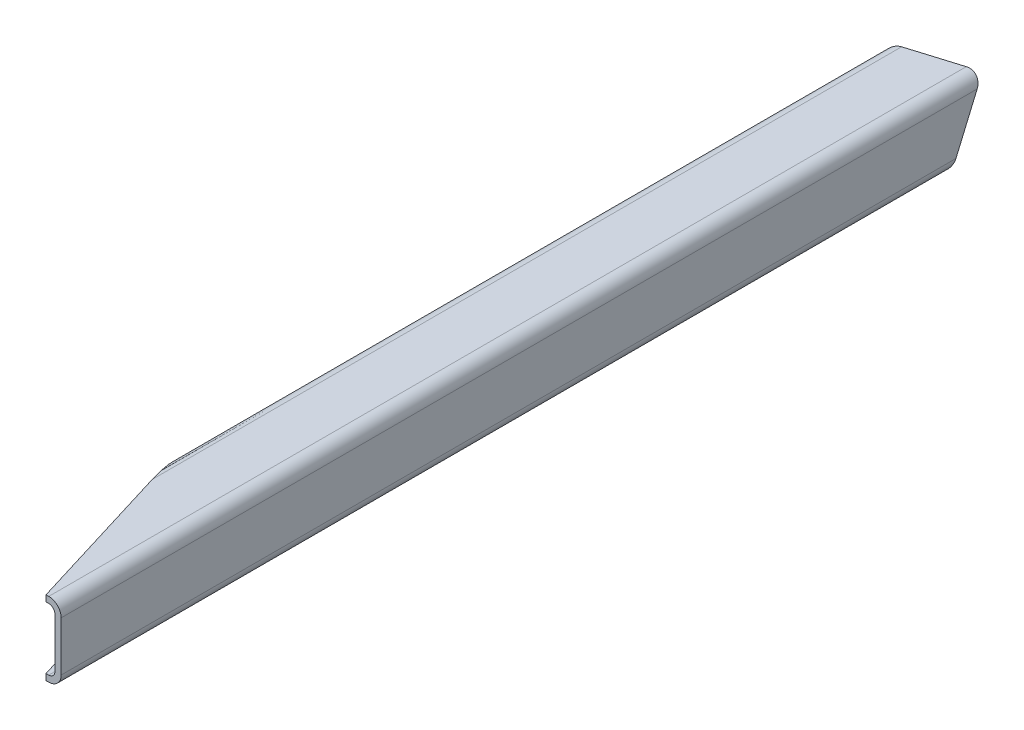
ISO-10303-21;
HEADER;
FILE_DESCRIPTION(('STEP AP214'),'2;1');
FILE_NAME('part.step','',(''),(''),'','','');
FILE_SCHEMA(('AUTOMOTIVE_DESIGN { 1 0 10303 214 1 1 1 1 }'));
ENDSEC;
DATA;
#1=APPLICATION_CONTEXT('core data for automotive mechanical design processes');
#2=APPLICATION_PROTOCOL_DEFINITION('international standard','automotive_design',2000,#1);
#3=PRODUCT_CONTEXT('',#1,'mechanical');
#4=PRODUCT('Part','Part','',(#3));
#5=PRODUCT_RELATED_PRODUCT_CATEGORY('part','',(#4));
#6=PRODUCT_DEFINITION_FORMATION('','',#4);
#7=PRODUCT_DEFINITION_CONTEXT('part definition',#1,'design');
#8=PRODUCT_DEFINITION('design','',#6,#7);
#9=PRODUCT_DEFINITION_SHAPE('','',#8);
#10=(LENGTH_UNIT() NAMED_UNIT(*) SI_UNIT(.MILLI.,.METRE.));
#11=(NAMED_UNIT(*) PLANE_ANGLE_UNIT() SI_UNIT($,.RADIAN.));
#12=(NAMED_UNIT(*) SI_UNIT($,.STERADIAN.) SOLID_ANGLE_UNIT());
#13=UNCERTAINTY_MEASURE_WITH_UNIT(LENGTH_MEASURE(1.E-05),#10,'distance_accuracy_value','');
#14=(GEOMETRIC_REPRESENTATION_CONTEXT(3) GLOBAL_UNCERTAINTY_ASSIGNED_CONTEXT((#13)) GLOBAL_UNIT_ASSIGNED_CONTEXT((#10,
#11,#12)) REPRESENTATION_CONTEXT('',''));
#15=CARTESIAN_POINT('',(0.,0.,0.));
#16=DIRECTION('',(0.,0.,1.));
#17=DIRECTION('',(1.,0.,0.));
#18=AXIS2_PLACEMENT_3D('',#15,#16,#17);
#19=CARTESIAN_POINT('',(25.4,-25.4,584.2));
#20=DIRECTION('',(0.,0.,-1.));
#21=DIRECTION('',(-1.,0.,0.));
#22=AXIS2_PLACEMENT_3D('',#19,#20,#21);
#23=CYLINDRICAL_SURFACE('',#22,12.7);
#24=DIRECTION('',(0.,0.,-1.));
#25=VECTOR('',#24,1.);
#26=CARTESIAN_POINT('',(25.3999999999999,-38.1,584.2));
#27=LINE('',#26,#25);
#28=CARTESIAN_POINT('',(25.3999999999999,-38.1,533.400000000001));
#29=VERTEX_POINT('',#28);
#30=CARTESIAN_POINT('',(25.3999999999999,-38.1,-374.694892337501));
#31=VERTEX_POINT('',#30);
#32=EDGE_CURVE('E183',#29,#31,#27,.T.);
#33=ORIENTED_EDGE('',*,*,#32,.T.);
#34=CARTESIAN_POINT('',(25.4,-25.4,-380.130488184915));
#35=DIRECTION('',(0.27058408825258,0.378797118906256,0.885040673581073));
#36=DIRECTION('',(0.514437970469112,0.72017398483454,-0.465513701309812));
#37=AXIS2_PLACEMENT_3D('',#34,#35,#36);
#38=ELLIPSE('',#37,14.3496229937241,12.7);
#39=CARTESIAN_POINT('',(38.1,-25.3999999999999,-384.01326783944));
#40=VERTEX_POINT('',#39);
#41=EDGE_CURVE('E169',#31,#40,#38,.T.);
#42=ORIENTED_EDGE('',*,*,#41,.T.);
#43=DIRECTION('',(0.,0.,-1.));
#44=VECTOR('',#43,1.);
#45=CARTESIAN_POINT('',(38.1,-25.3999999999999,584.2));
#46=LINE('',#45,#44);
#47=CARTESIAN_POINT('',(38.1,-25.3999999999999,533.400000000001));
#48=VERTEX_POINT('',#47);
#49=EDGE_CURVE('E181',#48,#40,#46,.T.);
#50=ORIENTED_EDGE('',*,*,#49,.F.);
#51=CARTESIAN_POINT('',(25.4,-25.4,533.400000000001));
#52=DIRECTION('',(0.,0.,-1.));
#53=DIRECTION('',(-1.,0.,0.));
#54=AXIS2_PLACEMENT_3D('',#51,#52,#53);
#55=CIRCLE('',#54,12.7);
#56=EDGE_CURVE('E321',#48,#29,#55,.T.);
#57=ORIENTED_EDGE('',*,*,#56,.T.);
#58=EDGE_LOOP('',(#33,#42,#50,#57));
#59=FACE_BOUND('',#58,.T.);
#60=ADVANCED_FACE('F42',(#59),#23,.T.);
#61=CARTESIAN_POINT('',(25.4,25.4,584.2));
#62=DIRECTION('',(0.,0.,-1.));
#63=DIRECTION('',(-1.,0.,0.));
#64=AXIS2_PLACEMENT_3D('',#61,#62,#63);
#65=CYLINDRICAL_SURFACE('',#64,12.7);
#66=DIRECTION('',(0.,0.,-1.));
#67=VECTOR('',#66,1.);
#68=CARTESIAN_POINT('',(38.1,25.3999999999999,584.2));
#69=LINE('',#68,#67);
#70=CARTESIAN_POINT('',(38.1,25.3999999999999,533.400000000001));
#71=VERTEX_POINT('',#70);
#72=CARTESIAN_POINT('',(38.1,25.3999999999999,-405.755651229095));
#73=VERTEX_POINT('',#72);
#74=EDGE_CURVE('E190',#71,#73,#69,.T.);
#75=ORIENTED_EDGE('',*,*,#74,.T.);
#76=CARTESIAN_POINT('',(25.4,25.4,-401.87287157457));
#77=DIRECTION('',(0.27058408825258,0.378797118906256,0.885040673581073));
#78=DIRECTION('',(0.514437970469112,0.72017398483454,-0.465513701309812));
#79=AXIS2_PLACEMENT_3D('',#76,#77,#78);
#80=ELLIPSE('',#79,14.3496229937241,12.7);
#81=CARTESIAN_POINT('',(25.3999999999999,38.1,-407.308467421983));
#82=VERTEX_POINT('',#81);
#83=EDGE_CURVE('E172',#73,#82,#80,.T.);
#84=ORIENTED_EDGE('',*,*,#83,.T.);
#85=DIRECTION('',(0.,0.,-1.));
#86=VECTOR('',#85,1.);
#87=CARTESIAN_POINT('',(25.3999999999999,38.1,584.2));
#88=LINE('',#87,#86);
#89=CARTESIAN_POINT('',(25.3999999999999,38.1,533.400000000001));
#90=VERTEX_POINT('',#89);
#91=EDGE_CURVE('E193',#90,#82,#88,.T.);
#92=ORIENTED_EDGE('',*,*,#91,.F.);
#93=CARTESIAN_POINT('',(25.4,25.4,533.400000000001));
#94=DIRECTION('',(0.,0.,-1.));
#95=DIRECTION('',(-1.,0.,0.));
#96=AXIS2_PLACEMENT_3D('',#93,#94,#95);
#97=CIRCLE('',#96,12.7);
#98=EDGE_CURVE('E275',#90,#71,#97,.T.);
#99=ORIENTED_EDGE('',*,*,#98,.T.);
#100=EDGE_LOOP('',(#75,#84,#92,#99));
#101=FACE_BOUND('',#100,.T.);
#102=ADVANCED_FACE('F274',(#101),#65,.T.);
#103=CARTESIAN_POINT('',(-25.3999999999999,38.1,584.2));
#104=DIRECTION('',(0.,-1.,0.));
#105=DIRECTION('',(0.,0.,-1.));
#106=AXIS2_PLACEMENT_3D('',#103,#104,#105);
#107=PLANE('',#106);
#108=ORIENTED_EDGE('',*,*,#91,.T.);
#109=DIRECTION('',(-0.956304755963033,0.,0.292371704722744));
#110=VECTOR('',#109,1.);
#111=CARTESIAN_POINT('',(-298.279803699668,38.1,-308.349620462476));
#112=LINE('',#111,#110);
#113=CARTESIAN_POINT('',(-25.3999999999999,38.1,-391.777348803883));
#114=VERTEX_POINT('',#113);
#115=EDGE_CURVE('E271',#82,#114,#112,.T.);
#116=ORIENTED_EDGE('',*,*,#115,.T.);
#117=DIRECTION('',(0.,0.,-1.));
#118=VECTOR('',#117,1.);
#119=CARTESIAN_POINT('',(-25.3999999999999,38.1,584.2));
#120=LINE('',#119,#118);
#121=CARTESIAN_POINT('',(-25.3999999999999,38.1,376.500858726261));
#122=VERTEX_POINT('',#121);
#123=EDGE_CURVE('E263',#122,#114,#120,.T.);
#124=ORIENTED_EDGE('',*,*,#123,.F.);
#125=DIRECTION('',(-0.292371704722741,0.,-0.956304755963034));
#126=VECTOR('',#125,1.);
#127=CARTESIAN_POINT('',(32.6719429286224,38.1,566.445625314803));
#128=LINE('',#127,#126);
#129=CARTESIAN_POINT('',(22.5688813819001,38.1,533.400000000001));
#130=VERTEX_POINT('',#129);
#131=EDGE_CURVE('E231',#130,#122,#128,.T.);
#132=ORIENTED_EDGE('',*,*,#131,.F.);
#133=DIRECTION('',(-1.,0.,0.));
#134=VECTOR('',#133,1.);
#135=CARTESIAN_POINT('',(22.5688813819001,38.1,533.400000000001));
#136=LINE('',#135,#134);
#137=EDGE_CURVE('E203',#90,#130,#136,.T.);
#138=ORIENTED_EDGE('',*,*,#137,.F.);
#139=EDGE_LOOP('',(#108,#116,#124,#132,#138));
#140=FACE_BOUND('',#139,.T.);
#141=ADVANCED_FACE('F269',(#140),#107,.F.);
#142=CARTESIAN_POINT('',(-25.4,25.4,584.2));
#143=DIRECTION('',(0.,0.,-1.));
#144=DIRECTION('',(-1.,0.,0.));
#145=AXIS2_PLACEMENT_3D('',#142,#143,#144);
#146=CYLINDRICAL_SURFACE('',#145,12.7);
#147=ORIENTED_EDGE('',*,*,#123,.T.);
#148=CARTESIAN_POINT('',(-25.4,25.4,-386.341752956469));
#149=DIRECTION('',(0.27058408825258,0.378797118906256,0.885040673581073));
#150=DIRECTION('',(0.514437970469112,0.72017398483454,-0.465513701309812));
#151=AXIS2_PLACEMENT_3D('',#148,#149,#150);
#152=ELLIPSE('',#151,14.3496229937241,12.7);
#153=CARTESIAN_POINT('',(-38.1,25.3999999999999,-382.458973301944));
#154=VERTEX_POINT('',#153);
#155=EDGE_CURVE('E285',#114,#154,#152,.T.);
#156=ORIENTED_EDGE('',*,*,#155,.T.);
#157=DIRECTION('',(0.,0.,-1.));
#158=VECTOR('',#157,1.);
#159=CARTESIAN_POINT('',(-38.1,25.3999999999999,584.2));
#160=LINE('',#159,#158);
#161=CARTESIAN_POINT('',(-38.1,25.3999999999999,334.961030471513));
#162=VERTEX_POINT('',#161);
#163=EDGE_CURVE('E260',#162,#154,#160,.T.);
#164=ORIENTED_EDGE('',*,*,#163,.F.);
#165=CARTESIAN_POINT('',(-25.4,25.4,376.500858726261));
#166=DIRECTION('',(-0.956304755963034,0.,0.292371704722741));
#167=DIRECTION('',(-0.292371704722741,0.,-0.956304755963034));
#168=AXIS2_PLACEMENT_3D('',#165,#166,#167);
#169=ELLIPSE('',#168,43.4378559718818,12.7);
#170=EDGE_CURVE('E235',#122,#162,#169,.T.);
#171=ORIENTED_EDGE('',*,*,#170,.F.);
#172=EDGE_LOOP('',(#147,#156,#164,#171));
#173=FACE_BOUND('',#172,.T.);
#174=ADVANCED_FACE('F343',(#173),#146,.T.);
#175=CARTESIAN_POINT('',(-38.1,-25.3999999999999,584.2));
#176=DIRECTION('',(1.,0.,0.));
#177=DIRECTION('',(0.,0.,-1.));
#178=AXIS2_PLACEMENT_3D('',#175,#176,#177);
#179=PLANE('',#178);
#180=ORIENTED_EDGE('',*,*,#163,.T.);
#181=DIRECTION('',(0.,-0.919335238873682,0.393475181638017));
#182=VECTOR('',#181,1.);
#183=CARTESIAN_POINT('',(-38.1,-367.209969698306,-214.422034644833));
#184=LINE('',#183,#182);
#185=CARTESIAN_POINT('',(-38.1,-25.4,-360.71658991229));
#186=VERTEX_POINT('',#185);
#187=EDGE_CURVE('E282',#154,#186,#184,.T.);
#188=ORIENTED_EDGE('',*,*,#187,.T.);
#189=DIRECTION('',(0.,0.,-1.));
#190=VECTOR('',#189,1.);
#191=CARTESIAN_POINT('',(-38.1,-25.4,584.2));
#192=LINE('',#191,#190);
#193=CARTESIAN_POINT('',(-38.1,-25.4,334.961030471513));
#194=VERTEX_POINT('',#193);
#195=EDGE_CURVE('E257',#194,#186,#192,.T.);
#196=ORIENTED_EDGE('',*,*,#195,.F.);
#197=DIRECTION('',(0.,-1.,0.));
#198=VECTOR('',#197,1.);
#199=CARTESIAN_POINT('',(-38.1,1168.4,334.961030471513));
#200=LINE('',#199,#198);
#201=EDGE_CURVE('E325',#162,#194,#200,.T.);
#202=ORIENTED_EDGE('',*,*,#201,.F.);
#203=EDGE_LOOP('',(#180,#188,#196,#202));
#204=FACE_BOUND('',#203,.T.);
#205=ADVANCED_FACE('F342',(#204),#179,.F.);
#206=CARTESIAN_POINT('',(-25.4,-25.4,584.2));
#207=DIRECTION('',(0.,0.,-1.));
#208=DIRECTION('',(-1.,0.,0.));
#209=AXIS2_PLACEMENT_3D('',#206,#207,#208);
#210=CYLINDRICAL_SURFACE('',#209,12.7);
#211=ORIENTED_EDGE('',*,*,#195,.T.);
#212=CARTESIAN_POINT('',(-25.4,-25.4,-364.599369566815));
#213=DIRECTION('',(0.27058408825258,0.378797118906256,0.885040673581073));
#214=DIRECTION('',(0.514437970469112,0.72017398483454,-0.465513701309812));
#215=AXIS2_PLACEMENT_3D('',#212,#213,#214);
#216=ELLIPSE('',#215,14.3496229937241,12.7);
#217=CARTESIAN_POINT('',(-25.3999999999999,-38.1,-359.163773719401));
#218=VERTEX_POINT('',#217);
#219=EDGE_CURVE('E279',#186,#218,#216,.T.);
#220=ORIENTED_EDGE('',*,*,#219,.T.);
#221=DIRECTION('',(0.,0.,-1.));
#222=VECTOR('',#221,1.);
#223=CARTESIAN_POINT('',(-25.3999999999999,-38.1,584.2));
#224=LINE('',#223,#222);
#225=CARTESIAN_POINT('',(-25.3999999999999,-38.1,376.500858726261));
#226=VERTEX_POINT('',#225);
#227=EDGE_CURVE('E254',#226,#218,#224,.T.);
#228=ORIENTED_EDGE('',*,*,#227,.F.);
#229=CARTESIAN_POINT('',(-25.4,-25.4,376.500858726261));
#230=DIRECTION('',(-0.956304755963034,0.,0.292371704722741));
#231=DIRECTION('',(-0.292371704722741,0.,-0.956304755963034));
#232=AXIS2_PLACEMENT_3D('',#229,#230,#231);
#233=ELLIPSE('',#232,43.4378559718818,12.7);
#234=EDGE_CURVE('E223',#194,#226,#233,.T.);
#235=ORIENTED_EDGE('',*,*,#234,.F.);
#236=EDGE_LOOP('',(#211,#220,#228,#235));
#237=FACE_BOUND('',#236,.T.);
#238=ADVANCED_FACE('F345',(#237),#210,.T.);
#239=CARTESIAN_POINT('',(-25.3999999999999,-38.1,584.2));
#240=DIRECTION('',(0.,1.,0.));
#241=DIRECTION('',(0.,0.,1.));
#242=AXIS2_PLACEMENT_3D('',#239,#240,#241);
#243=PLANE('',#242);
#244=ORIENTED_EDGE('',*,*,#227,.T.);
#245=DIRECTION('',(0.956304755963033,0.,-0.292371704722744));
#246=VECTOR('',#245,1.);
#247=CARTESIAN_POINT('',(-289.161163827642,-38.1,-278.523893360045));
#248=LINE('',#247,#246);
#249=EDGE_CURVE('E184',#218,#31,#248,.T.);
#250=ORIENTED_EDGE('',*,*,#249,.T.);
#251=ORIENTED_EDGE('',*,*,#32,.F.);
#252=DIRECTION('',(-1.,0.,0.));
#253=VECTOR('',#252,1.);
#254=CARTESIAN_POINT('',(22.5688813819001,-38.1,533.400000000001));
#255=LINE('',#254,#253);
#256=CARTESIAN_POINT('',(22.5688813819001,-38.1,533.400000000001));
#257=VERTEX_POINT('',#256);
#258=EDGE_CURVE('E306',#29,#257,#255,.T.);
#259=ORIENTED_EDGE('',*,*,#258,.T.);
#260=DIRECTION('',(-0.292371704722741,0.,-0.956304755963034));
#261=VECTOR('',#260,1.);
#262=CARTESIAN_POINT('',(38.1,-38.1,584.2));
#263=LINE('',#262,#261);
#264=EDGE_CURVE('E323',#257,#226,#263,.T.);
#265=ORIENTED_EDGE('',*,*,#264,.T.);
#266=EDGE_LOOP('',(#244,#250,#251,#259,#265));
#267=FACE_BOUND('',#266,.T.);
#268=ADVANCED_FACE('F349',(#267),#243,.F.);
#269=CARTESIAN_POINT('',(-25.4,25.4,584.2));
#270=DIRECTION('',(0.,0.,-1.));
#271=DIRECTION('',(-1.,0.,0.));
#272=AXIS2_PLACEMENT_3D('',#269,#270,#271);
#273=CYLINDRICAL_SURFACE('',#272,6.34999999999999);
#274=CARTESIAN_POINT('',(-25.4,25.4,-386.341752956469));
#275=DIRECTION('',(0.27058408825258,0.378797118906256,0.885040673581073));
#276=DIRECTION('',(0.514437970469112,0.72017398483454,-0.465513701309812));
#277=AXIS2_PLACEMENT_3D('',#274,#275,#276);
#278=ELLIPSE('',#277,7.17481149686203,6.34999999999999);
#279=CARTESIAN_POINT('',(-25.3999999999999,31.75,-389.059550880176));
#280=VERTEX_POINT('',#279);
#281=CARTESIAN_POINT('',(-31.75,25.3999999999999,-384.400363129207));
#282=VERTEX_POINT('',#281);
#283=EDGE_CURVE('E229',#280,#282,#278,.T.);
#284=ORIENTED_EDGE('',*,*,#283,.F.);
#285=DIRECTION('',(0.,0.,-1.));
#286=VECTOR('',#285,1.);
#287=CARTESIAN_POINT('',(-25.3999999999999,31.75,584.2));
#288=LINE('',#287,#286);
#289=CARTESIAN_POINT('',(-25.3999999999999,31.75,376.500858726261));
#290=VERTEX_POINT('',#289);
#291=EDGE_CURVE('E226',#290,#280,#288,.T.);
#292=ORIENTED_EDGE('',*,*,#291,.F.);
#293=CARTESIAN_POINT('',(-25.4,25.4,376.500858726261));
#294=DIRECTION('',(-0.956304755963034,0.,0.292371704722741));
#295=DIRECTION('',(-0.292371704722741,0.,-0.956304755963034));
#296=AXIS2_PLACEMENT_3D('',#293,#294,#295);
#297=ELLIPSE('',#296,21.7189279859409,6.34999999999999);
#298=CARTESIAN_POINT('',(-31.75,25.3999999999999,355.730944598887));
#299=VERTEX_POINT('',#298);
#300=EDGE_CURVE('E218',#290,#299,#297,.T.);
#301=ORIENTED_EDGE('',*,*,#300,.T.);
#302=DIRECTION('',(0.,0.,-1.));
#303=VECTOR('',#302,1.);
#304=CARTESIAN_POINT('',(-31.75,25.3999999999999,584.2));
#305=LINE('',#304,#303);
#306=EDGE_CURVE('E251',#299,#282,#305,.T.);
#307=ORIENTED_EDGE('',*,*,#306,.T.);
#308=EDGE_LOOP('',(#284,#292,#301,#307));
#309=FACE_BOUND('',#308,.T.);
#310=ADVANCED_FACE('F227',(#309),#273,.F.);
#311=CARTESIAN_POINT('',(-31.75,-25.4,584.2));
#312=DIRECTION('',(1.,0.,0.));
#313=DIRECTION('',(0.,0.,-1.));
#314=AXIS2_PLACEMENT_3D('',#311,#312,#313);
#315=PLANE('',#314);
#316=DIRECTION('',(0.,-0.919335238873682,0.393475181638017));
#317=VECTOR('',#316,1.);
#318=CARTESIAN_POINT('',(-31.75,-367.912239512503,-216.062853221244));
#319=LINE('',#318,#317);
#320=CARTESIAN_POINT('',(-31.75,-25.4,-362.657979739552));
#321=VERTEX_POINT('',#320);
#322=EDGE_CURVE('E56',#282,#321,#319,.T.);
#323=ORIENTED_EDGE('',*,*,#322,.F.);
#324=ORIENTED_EDGE('',*,*,#306,.F.);
#325=DIRECTION('',(0.,-1.,0.));
#326=VECTOR('',#325,1.);
#327=CARTESIAN_POINT('',(-31.75,-25.4,355.730944598887));
#328=LINE('',#327,#326);
#329=CARTESIAN_POINT('',(-31.75,-25.4,355.730944598887));
#330=VERTEX_POINT('',#329);
#331=EDGE_CURVE('E221',#299,#330,#328,.T.);
#332=ORIENTED_EDGE('',*,*,#331,.T.);
#333=DIRECTION('',(0.,0.,-1.));
#334=VECTOR('',#333,1.);
#335=CARTESIAN_POINT('',(-31.75,-25.4,584.2));
#336=LINE('',#335,#334);
#337=EDGE_CURVE('E249',#330,#321,#336,.T.);
#338=ORIENTED_EDGE('',*,*,#337,.T.);
#339=EDGE_LOOP('',(#323,#324,#332,#338));
#340=FACE_BOUND('',#339,.T.);
#341=ADVANCED_FACE('F361',(#340),#315,.T.);
#342=CARTESIAN_POINT('',(-25.4,-25.4,584.2));
#343=DIRECTION('',(0.,0.,-1.));
#344=DIRECTION('',(-1.,0.,0.));
#345=AXIS2_PLACEMENT_3D('',#342,#343,#344);
#346=CYLINDRICAL_SURFACE('',#345,6.34999999999999);
#347=CARTESIAN_POINT('',(-25.4,-25.4,-364.599369566815));
#348=DIRECTION('',(0.27058408825258,0.378797118906256,0.885040673581073));
#349=DIRECTION('',(0.514437970469112,0.72017398483454,-0.465513701309812));
#350=AXIS2_PLACEMENT_3D('',#347,#348,#349);
#351=ELLIPSE('',#350,7.17481149686203,6.34999999999999);
#352=CARTESIAN_POINT('',(-25.3999999999999,-31.75,-361.881571643108));
#353=VERTEX_POINT('',#352);
#354=EDGE_CURVE('E64',#321,#353,#351,.T.);
#355=ORIENTED_EDGE('',*,*,#354,.F.);
#356=ORIENTED_EDGE('',*,*,#337,.F.);
#357=CARTESIAN_POINT('',(-25.4,-25.4,376.500858726261));
#358=DIRECTION('',(-0.956304755963034,0.,0.292371704722741));
#359=DIRECTION('',(-0.292371704722741,0.,-0.956304755963034));
#360=AXIS2_PLACEMENT_3D('',#357,#358,#359);
#361=ELLIPSE('',#360,21.7189279859409,6.34999999999999);
#362=CARTESIAN_POINT('',(-25.3999999999999,-31.75,376.500858726261));
#363=VERTEX_POINT('',#362);
#364=EDGE_CURVE('E330',#330,#363,#361,.T.);
#365=ORIENTED_EDGE('',*,*,#364,.T.);
#366=DIRECTION('',(0.,0.,-1.));
#367=VECTOR('',#366,1.);
#368=CARTESIAN_POINT('',(-25.3999999999999,-31.75,584.2));
#369=LINE('',#368,#367);
#370=EDGE_CURVE('E247',#363,#353,#369,.T.);
#371=ORIENTED_EDGE('',*,*,#370,.T.);
#372=EDGE_LOOP('',(#355,#356,#365,#371));
#373=FACE_BOUND('',#372,.T.);
#374=ADVANCED_FACE('F360',(#373),#346,.F.);
#375=CARTESIAN_POINT('',(-25.3999999999999,-31.75,584.2));
#376=DIRECTION('',(0.,1.,0.));
#377=DIRECTION('',(0.,0.,1.));
#378=AXIS2_PLACEMENT_3D('',#375,#376,#377);
#379=PLANE('',#378);
#380=DIRECTION('',(0.956304755963033,0.,-0.292371704722744));
#381=VECTOR('',#380,1.);
#382=CARTESIAN_POINT('',(-289.921050483644,-31.75,-281.009370618581));
#383=LINE('',#382,#381);
#384=CARTESIAN_POINT('',(25.4,-31.75,-377.412690261208));
#385=VERTEX_POINT('',#384);
#386=EDGE_CURVE('E300',#353,#385,#383,.T.);
#387=ORIENTED_EDGE('',*,*,#386,.F.);
#388=ORIENTED_EDGE('',*,*,#370,.F.);
#389=DIRECTION('',(0.292371704722741,0.,0.956304755963034));
#390=VECTOR('',#389,1.);
#391=CARTESIAN_POINT('',(32.6719429286224,-31.75,566.445625314803));
#392=LINE('',#391,#390);
#393=CARTESIAN_POINT('',(22.5688813819001,-31.75,533.400000000001));
#394=VERTEX_POINT('',#393);
#395=EDGE_CURVE('E327',#363,#394,#392,.T.);
#396=ORIENTED_EDGE('',*,*,#395,.T.);
#397=DIRECTION('',(-1.,0.,0.));
#398=VECTOR('',#397,1.);
#399=CARTESIAN_POINT('',(-25.3999999999999,-31.75,533.400000000001));
#400=LINE('',#399,#398);
#401=CARTESIAN_POINT('',(25.4,-31.75,533.400000000001));
#402=VERTEX_POINT('',#401);
#403=EDGE_CURVE('E318',#402,#394,#400,.T.);
#404=ORIENTED_EDGE('',*,*,#403,.F.);
#405=DIRECTION('',(0.,0.,-1.));
#406=VECTOR('',#405,1.);
#407=CARTESIAN_POINT('',(25.4,-31.75,584.2));
#408=LINE('',#407,#406);
#409=EDGE_CURVE('E244',#402,#385,#408,.T.);
#410=ORIENTED_EDGE('',*,*,#409,.T.);
#411=EDGE_LOOP('',(#387,#388,#396,#404,#410));
#412=FACE_BOUND('',#411,.T.);
#413=ADVANCED_FACE('F354',(#412),#379,.T.);
#414=CARTESIAN_POINT('',(25.4,-25.4,584.2));
#415=DIRECTION('',(0.,0.,-1.));
#416=DIRECTION('',(-1.,0.,0.));
#417=AXIS2_PLACEMENT_3D('',#414,#415,#416);
#418=CYLINDRICAL_SURFACE('',#417,6.34999999999999);
#419=CARTESIAN_POINT('',(25.4,-25.4,-380.130488184915));
#420=DIRECTION('',(0.27058408825258,0.378797118906256,0.885040673581073));
#421=DIRECTION('',(0.514437970469112,0.72017398483454,-0.465513701309812));
#422=AXIS2_PLACEMENT_3D('',#419,#420,#421);
#423=ELLIPSE('',#422,7.17481149686203,6.34999999999999);
#424=CARTESIAN_POINT('',(31.75,-25.3999999999999,-382.071878012177));
#425=VERTEX_POINT('',#424);
#426=EDGE_CURVE('E297',#385,#425,#423,.T.);
#427=ORIENTED_EDGE('',*,*,#426,.F.);
#428=ORIENTED_EDGE('',*,*,#409,.F.);
#429=CARTESIAN_POINT('',(25.4,-25.4,533.400000000001));
#430=DIRECTION('',(0.,0.,-1.));
#431=DIRECTION('',(-1.,0.,0.));
#432=AXIS2_PLACEMENT_3D('',#429,#430,#431);
#433=CIRCLE('',#432,6.34999999999999);
#434=CARTESIAN_POINT('',(31.75,-25.3999999999999,533.400000000001));
#435=VERTEX_POINT('',#434);
#436=EDGE_CURVE('E316',#435,#402,#433,.T.);
#437=ORIENTED_EDGE('',*,*,#436,.F.);
#438=DIRECTION('',(0.,0.,-1.));
#439=VECTOR('',#438,1.);
#440=CARTESIAN_POINT('',(31.75,-25.3999999999999,584.2));
#441=LINE('',#440,#439);
#442=EDGE_CURVE('E241',#435,#425,#441,.T.);
#443=ORIENTED_EDGE('',*,*,#442,.T.);
#444=EDGE_LOOP('',(#427,#428,#437,#443));
#445=FACE_BOUND('',#444,.T.);
#446=ADVANCED_FACE('F357',(#445),#418,.F.);
#447=CARTESIAN_POINT('',(31.75,-25.3999999999999,584.2));
#448=DIRECTION('',(-1.,0.,0.));
#449=DIRECTION('',(0.,0.,1.));
#450=AXIS2_PLACEMENT_3D('',#447,#448,#449);
#451=PLANE('',#450);
#452=DIRECTION('',(0.,0.919335238873682,-0.393475181638017));
#453=VECTOR('',#452,1.);
#454=CARTESIAN_POINT('',(31.75,-374.934937654471,-232.471038985356));
#455=LINE('',#454,#453);
#456=CARTESIAN_POINT('',(31.75,25.4,-403.814261401832));
#457=VERTEX_POINT('',#456);
#458=EDGE_CURVE('E294',#425,#457,#455,.T.);
#459=ORIENTED_EDGE('',*,*,#458,.F.);
#460=ORIENTED_EDGE('',*,*,#442,.F.);
#461=DIRECTION('',(0.,-1.,0.));
#462=VECTOR('',#461,1.);
#463=CARTESIAN_POINT('',(31.75,-25.3999999999999,533.400000000001));
#464=LINE('',#463,#462);
#465=CARTESIAN_POINT('',(31.75,25.4,533.400000000001));
#466=VERTEX_POINT('',#465);
#467=EDGE_CURVE('E314',#466,#435,#464,.T.);
#468=ORIENTED_EDGE('',*,*,#467,.F.);
#469=DIRECTION('',(0.,0.,-1.));
#470=VECTOR('',#469,1.);
#471=CARTESIAN_POINT('',(31.75,25.4,584.2));
#472=LINE('',#471,#470);
#473=EDGE_CURVE('E233',#466,#457,#472,.T.);
#474=ORIENTED_EDGE('',*,*,#473,.T.);
#475=EDGE_LOOP('',(#459,#460,#468,#474));
#476=FACE_BOUND('',#475,.T.);
#477=ADVANCED_FACE('F367',(#476),#451,.T.);
#478=CARTESIAN_POINT('',(25.4,25.4,584.2));
#479=DIRECTION('',(0.,0.,-1.));
#480=DIRECTION('',(-1.,0.,0.));
#481=AXIS2_PLACEMENT_3D('',#478,#479,#480);
#482=CYLINDRICAL_SURFACE('',#481,6.34999999999999);
#483=CARTESIAN_POINT('',(25.4,25.4,-401.87287157457));
#484=DIRECTION('',(0.27058408825258,0.378797118906256,0.885040673581073));
#485=DIRECTION('',(0.514437970469112,0.72017398483454,-0.465513701309812));
#486=AXIS2_PLACEMENT_3D('',#483,#484,#485);
#487=ELLIPSE('',#486,7.17481149686203,6.34999999999999);
#488=CARTESIAN_POINT('',(25.3999999999999,31.75,-404.590669498276));
#489=VERTEX_POINT('',#488);
#490=EDGE_CURVE('E291',#457,#489,#487,.T.);
#491=ORIENTED_EDGE('',*,*,#490,.F.);
#492=ORIENTED_EDGE('',*,*,#473,.F.);
#493=CARTESIAN_POINT('',(25.4,25.4,533.400000000001));
#494=DIRECTION('',(0.,0.,-1.));
#495=DIRECTION('',(-1.,0.,0.));
#496=AXIS2_PLACEMENT_3D('',#493,#494,#495);
#497=CIRCLE('',#496,6.34999999999999);
#498=CARTESIAN_POINT('',(25.3999999999999,31.75,533.400000000001));
#499=VERTEX_POINT('',#498);
#500=EDGE_CURVE('E213',#499,#466,#497,.T.);
#501=ORIENTED_EDGE('',*,*,#500,.F.);
#502=DIRECTION('',(0.,0.,-1.));
#503=VECTOR('',#502,1.);
#504=CARTESIAN_POINT('',(25.3999999999999,31.75,584.2));
#505=LINE('',#504,#503);
#506=EDGE_CURVE('E212',#499,#489,#505,.T.);
#507=ORIENTED_EDGE('',*,*,#506,.T.);
#508=EDGE_LOOP('',(#491,#492,#501,#507));
#509=FACE_BOUND('',#508,.T.);
#510=ADVANCED_FACE('F363',(#509),#482,.F.);
#511=CARTESIAN_POINT('',(-25.3999999999999,31.75,584.2));
#512=DIRECTION('',(0.,-1.,0.));
#513=DIRECTION('',(0.,0.,-1.));
#514=AXIS2_PLACEMENT_3D('',#511,#512,#513);
#515=PLANE('',#514);
#516=DIRECTION('',(-0.956304755963033,0.,0.292371704722744));
#517=VECTOR('',#516,1.);
#518=CARTESIAN_POINT('',(-297.519917043666,31.75,-305.86414320394));
#519=LINE('',#518,#517);
#520=EDGE_CURVE('E289',#489,#280,#519,.T.);
#521=ORIENTED_EDGE('',*,*,#520,.F.);
#522=ORIENTED_EDGE('',*,*,#506,.F.);
#523=DIRECTION('',(1.,0.,0.));
#524=VECTOR('',#523,1.);
#525=CARTESIAN_POINT('',(-25.3999999999999,31.75,533.400000000001));
#526=LINE('',#525,#524);
#527=CARTESIAN_POINT('',(22.5688813819001,31.7499999999999,533.400000000001));
#528=VERTEX_POINT('',#527);
#529=EDGE_CURVE('E200',#528,#499,#526,.T.);
#530=ORIENTED_EDGE('',*,*,#529,.F.);
#531=DIRECTION('',(-0.292371704722741,0.,-0.956304755963034));
#532=VECTOR('',#531,1.);
#533=CARTESIAN_POINT('',(32.6719429286224,31.75,566.445625314803));
#534=LINE('',#533,#532);
#535=EDGE_CURVE('E189',#528,#290,#534,.T.);
#536=ORIENTED_EDGE('',*,*,#535,.T.);
#537=ORIENTED_EDGE('',*,*,#291,.T.);
#538=EDGE_LOOP('',(#521,#522,#530,#536,#537));
#539=FACE_BOUND('',#538,.T.);
#540=ADVANCED_FACE('F209',(#539),#515,.T.);
#541=CARTESIAN_POINT('',(38.1,-25.3999999999999,584.2));
#542=DIRECTION('',(-1.,0.,0.));
#543=DIRECTION('',(0.,0.,1.));
#544=AXIS2_PLACEMENT_3D('',#541,#542,#543);
#545=PLANE('',#544);
#546=ORIENTED_EDGE('',*,*,#49,.T.);
#547=DIRECTION('',(0.,0.919335238873682,-0.393475181638017));
#548=VECTOR('',#547,1.);
#549=CARTESIAN_POINT('',(38.1,-375.637207468668,-234.111857561767));
#550=LINE('',#549,#548);
#551=EDGE_CURVE('E12',#40,#73,#550,.T.);
#552=ORIENTED_EDGE('',*,*,#551,.T.);
#553=ORIENTED_EDGE('',*,*,#74,.F.);
#554=DIRECTION('',(0.,1.,0.));
#555=VECTOR('',#554,1.);
#556=CARTESIAN_POINT('',(38.1,-38.1,533.400000000001));
#557=LINE('',#556,#555);
#558=EDGE_CURVE('E188',#48,#71,#557,.T.);
#559=ORIENTED_EDGE('',*,*,#558,.F.);
#560=EDGE_LOOP('',(#546,#552,#553,#559));
#561=FACE_BOUND('',#560,.T.);
#562=ADVANCED_FACE('F187',(#561),#545,.F.);
#563=CARTESIAN_POINT('',(38.1,1168.4,584.2));
#564=DIRECTION('',(-0.956304755963034,0.,0.292371704722741));
#565=DIRECTION('',(0.292371704722741,0.,0.956304755963034));
#566=AXIS2_PLACEMENT_3D('',#563,#564,#565);
#567=PLANE('',#566);
#568=DIRECTION('',(0.,-1.,0.));
#569=VECTOR('',#568,1.);
#570=CARTESIAN_POINT('',(22.5688813819001,1168.4,533.400000000001));
#571=LINE('',#570,#569);
#572=EDGE_CURVE('E49',#130,#528,#571,.T.);
#573=ORIENTED_EDGE('',*,*,#572,.F.);
#574=ORIENTED_EDGE('',*,*,#131,.T.);
#575=ORIENTED_EDGE('',*,*,#170,.T.);
#576=ORIENTED_EDGE('',*,*,#201,.T.);
#577=ORIENTED_EDGE('',*,*,#234,.T.);
#578=ORIENTED_EDGE('',*,*,#264,.F.);
#579=DIRECTION('',(0.,1.,0.));
#580=VECTOR('',#579,1.);
#581=CARTESIAN_POINT('',(22.5688813819001,-38.1,533.400000000001));
#582=LINE('',#581,#580);
#583=EDGE_CURVE('E214',#257,#394,#582,.T.);
#584=ORIENTED_EDGE('',*,*,#583,.T.);
#585=ORIENTED_EDGE('',*,*,#395,.F.);
#586=ORIENTED_EDGE('',*,*,#364,.F.);
#587=ORIENTED_EDGE('',*,*,#331,.F.);
#588=ORIENTED_EDGE('',*,*,#300,.F.);
#589=ORIENTED_EDGE('',*,*,#535,.F.);
#590=EDGE_LOOP('',(#573,#574,#575,#576,#577,#578,#584,#585,#586,#587,#588,#589));
#591=FACE_BOUND('',#590,.T.);
#592=ADVANCED_FACE('F216',(#591),#567,.T.);
#593=CARTESIAN_POINT('',(22.5688813819001,-38.1,533.400000000001));
#594=DIRECTION('',(0.,0.,-1.));
#595=DIRECTION('',(-1.,0.,0.));
#596=AXIS2_PLACEMENT_3D('',#593,#594,#595);
#597=PLANE('',#596);
#598=ORIENTED_EDGE('',*,*,#558,.T.);
#599=ORIENTED_EDGE('',*,*,#98,.F.);
#600=ORIENTED_EDGE('',*,*,#137,.T.);
#601=ORIENTED_EDGE('',*,*,#572,.T.);
#602=ORIENTED_EDGE('',*,*,#529,.T.);
#603=ORIENTED_EDGE('',*,*,#500,.T.);
#604=ORIENTED_EDGE('',*,*,#467,.T.);
#605=ORIENTED_EDGE('',*,*,#436,.T.);
#606=ORIENTED_EDGE('',*,*,#403,.T.);
#607=ORIENTED_EDGE('',*,*,#583,.F.);
#608=ORIENTED_EDGE('',*,*,#258,.F.);
#609=ORIENTED_EDGE('',*,*,#56,.F.);
#610=EDGE_LOOP('',(#598,#599,#600,#601,#602,#603,#604,#605,#606,#607,#608,#609));
#611=FACE_BOUND('',#610,.T.);
#612=ADVANCED_FACE('F199',(#611),#597,.F.);
#613=CARTESIAN_POINT('',(-91.776590451476,-128.480237958235,-300.187701193749));
#614=DIRECTION('',(0.27058408825258,0.378797118906256,0.885040673581073));
#615=DIRECTION('',(0.,-0.919335238873682,0.393475181638017));
#616=AXIS2_PLACEMENT_3D('',#613,#614,#615);
#617=PLANE('',#616);
#618=ORIENTED_EDGE('',*,*,#520,.T.);
#619=ORIENTED_EDGE('',*,*,#283,.T.);
#620=ORIENTED_EDGE('',*,*,#322,.T.);
#621=ORIENTED_EDGE('',*,*,#354,.T.);
#622=ORIENTED_EDGE('',*,*,#386,.T.);
#623=ORIENTED_EDGE('',*,*,#426,.T.);
#624=ORIENTED_EDGE('',*,*,#458,.T.);
#625=ORIENTED_EDGE('',*,*,#490,.T.);
#626=EDGE_LOOP('',(#618,#619,#620,#621,#622,#623,#624,#625));
#627=FACE_BOUND('',#626,.T.);
#628=ORIENTED_EDGE('',*,*,#115,.F.);
#629=ORIENTED_EDGE('',*,*,#83,.F.);
#630=ORIENTED_EDGE('',*,*,#551,.F.);
#631=ORIENTED_EDGE('',*,*,#41,.F.);
#632=ORIENTED_EDGE('',*,*,#249,.F.);
#633=ORIENTED_EDGE('',*,*,#219,.F.);
#634=ORIENTED_EDGE('',*,*,#187,.F.);
#635=ORIENTED_EDGE('',*,*,#155,.F.);
#636=EDGE_LOOP('',(#628,#629,#630,#631,#632,#633,#634,#635));
#637=FACE_BOUND('',#636,.T.);
#638=ADVANCED_FACE('F168',(#627,#637),#617,.F.);
#639=CLOSED_SHELL('',(#60,#102,#141,#174,#205,#238,#268,#310,#341,#374,#413,#446,#477,#510,#540,
#562,#592,#612,#638));
#640=MANIFOLD_SOLID_BREP('B2',#639);
#641=ADVANCED_BREP_SHAPE_REPRESENTATION('',(#18,#640),#14);
#642=SHAPE_DEFINITION_REPRESENTATION(#9,#641);
ENDSEC;
END-ISO-10303-21;
